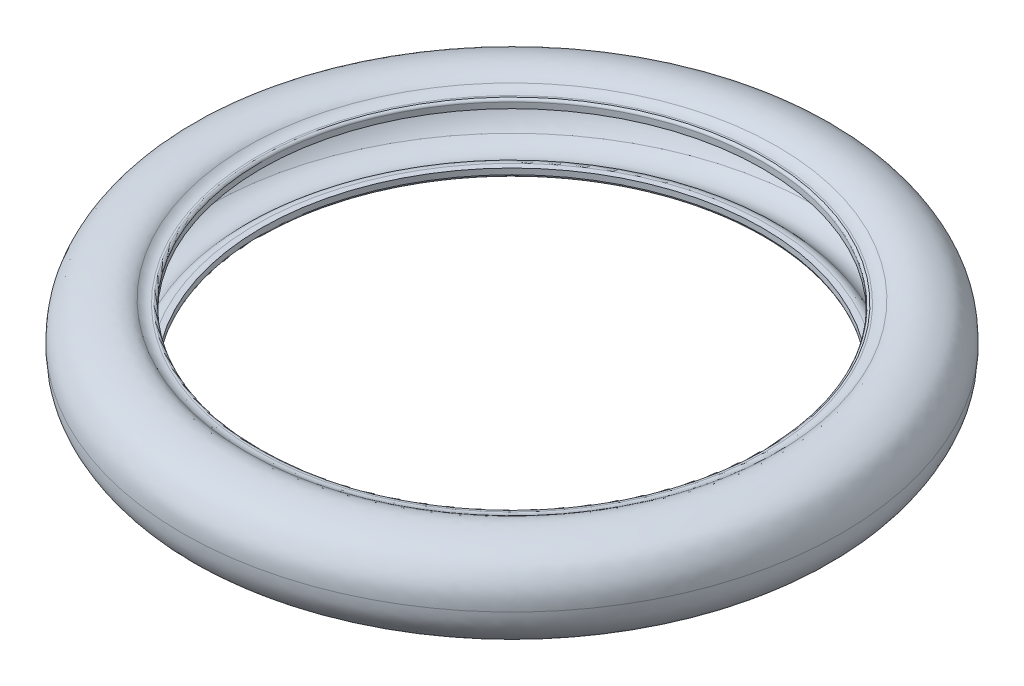
ISO-10303-21;
HEADER;
FILE_DESCRIPTION(('STEP AP214'),'2;1');
FILE_NAME('part.step','',(''),(''),'','','');
FILE_SCHEMA(('AUTOMOTIVE_DESIGN { 1 0 10303 214 1 1 1 1 }'));
ENDSEC;
DATA;
#1=APPLICATION_CONTEXT('core data for automotive mechanical design processes');
#2=APPLICATION_PROTOCOL_DEFINITION('international standard','automotive_design',2000,#1);
#3=PRODUCT_CONTEXT('',#1,'mechanical');
#4=PRODUCT('Part','Part','',(#3));
#5=PRODUCT_RELATED_PRODUCT_CATEGORY('part','',(#4));
#6=PRODUCT_DEFINITION_FORMATION('','',#4);
#7=PRODUCT_DEFINITION_CONTEXT('part definition',#1,'design');
#8=PRODUCT_DEFINITION('design','',#6,#7);
#9=PRODUCT_DEFINITION_SHAPE('','',#8);
#10=(LENGTH_UNIT() NAMED_UNIT(*) SI_UNIT(.MILLI.,.METRE.));
#11=(NAMED_UNIT(*) PLANE_ANGLE_UNIT() SI_UNIT($,.RADIAN.));
#12=(NAMED_UNIT(*) SI_UNIT($,.STERADIAN.) SOLID_ANGLE_UNIT());
#13=UNCERTAINTY_MEASURE_WITH_UNIT(LENGTH_MEASURE(1.E-05),#10,'distance_accuracy_value','');
#14=(GEOMETRIC_REPRESENTATION_CONTEXT(3) GLOBAL_UNCERTAINTY_ASSIGNED_CONTEXT((#13)) GLOBAL_UNIT_ASSIGNED_CONTEXT((#10,
#11,#12)) REPRESENTATION_CONTEXT('',''));
#15=CARTESIAN_POINT('',(0.,0.,0.));
#16=DIRECTION('',(0.,0.,1.));
#17=DIRECTION('',(1.,0.,0.));
#18=AXIS2_PLACEMENT_3D('',#15,#16,#17);
#19=CARTESIAN_POINT('',(142.63119047619,44.0640624999995,0.));
#20=CARTESIAN_POINT('',(142.63119047619,48.4486359022478,0.));
#21=CARTESIAN_POINT('',(142.234474417084,53.4871682416019,0.));
#22=CARTESIAN_POINT('',(139.548984913312,60.6335036895435,0.));
#23=CARTESIAN_POINT('',(137.277996398986,64.4635629481419,0.));
#24=CARTESIAN_POINT('',(131.714043509661,71.8996116292628,0.));
#25=CARTESIAN_POINT('',(124.532463533844,75.146316929885,0.));
#26=CARTESIAN_POINT('',(115.420380537841,77.9769245962998,0.));
#27=CARTESIAN_POINT('',(104.099152613095,79.9741478079657,0.));
#28=CARTESIAN_POINT('',(93.4534855770394,77.2529926246921,0.));
#29=CARTESIAN_POINT('',(90.4251722590828,74.6243240215453,0.));
#30=B_SPLINE_CURVE_WITH_KNOTS('',3,(#19,#20,#21,#22,#23,#24,#25,#26,#27,#28,#29),.UNSPECIFIED.,
.F.,.F.,(4,1,1,1,1,1,1,1,4),(0.,0.140869790199611,0.175397335911017,0.326400110313725,
0.368720757355132,0.556283159283683,0.603112180979877,0.813565674076001,1.),.UNSPECIFIED.);
#31=CARTESIAN_POINT('',(-124.06880952381,89.0640624999997,0.));
#32=DIRECTION('',(0.,1.,0.));
#33=AXIS1_PLACEMENT('',#31,#32);
#34=SURFACE_OF_REVOLUTION('',#30,#33);
#35=CARTESIAN_POINT('',(-124.06880952381,74.6243240215452,0.));
#36=DIRECTION('',(0.,1.,0.));
#37=DIRECTION('',(0.,0.,1.));
#38=AXIS2_PLACEMENT_3D('',#35,#36,#37);
#39=CIRCLE('',#38,214.493981782892);
#40=CARTESIAN_POINT('',(-124.06880952381,74.6243240215452,214.493981782892));
#41=VERTEX_POINT('',#40);
#42=EDGE_CURVE('E10',#41,#41,#39,.T.);
#43=ORIENTED_EDGE('',*,*,#42,.F.);
#44=EDGE_LOOP('',(#43));
#45=FACE_BOUND('',#44,.T.);
#46=CARTESIAN_POINT('',(-124.06880952381,44.0640624999996,0.));
#47=DIRECTION('',(0.,1.,0.));
#48=DIRECTION('',(0.,0.,1.));
#49=AXIS2_PLACEMENT_3D('',#46,#47,#48);
#50=CIRCLE('',#49,266.7);
#51=CARTESIAN_POINT('',(-124.06880952381,44.0640624999996,266.7));
#52=VERTEX_POINT('',#51);
#53=EDGE_CURVE('E93',#52,#52,#50,.T.);
#54=ORIENTED_EDGE('',*,*,#53,.T.);
#55=EDGE_LOOP('',(#54));
#56=FACE_BOUND('',#55,.T.);
#57=ADVANCED_FACE('F28',(#45,#56),#34,.T.);
#58=CARTESIAN_POINT('',(-124.06880952381,84.0640624999998,0.));
#59=DIRECTION('',(0.,1.,0.));
#60=DIRECTION('',(0.,0.,1.));
#61=AXIS2_PLACEMENT_3D('',#58,#59,#60);
#62=TOROIDAL_SURFACE('',#61,206.299999999999,12.5);
#63=CARTESIAN_POINT('',(-124.06880952381,71.5640624999998,0.));
#64=DIRECTION('',(0.,1.,0.));
#65=DIRECTION('',(0.,0.,1.));
#66=AXIS2_PLACEMENT_3D('',#63,#64,#65);
#67=CIRCLE('',#66,206.299999999999);
#68=CARTESIAN_POINT('',(-124.06880952381,71.5640624999998,206.299999999999));
#69=VERTEX_POINT('',#68);
#70=EDGE_CURVE('E35',#69,#69,#67,.T.);
#71=ORIENTED_EDGE('',*,*,#70,.F.);
#72=EDGE_LOOP('',(#71));
#73=FACE_BOUND('',#72,.T.);
#74=ORIENTED_EDGE('',*,*,#42,.T.);
#75=EDGE_LOOP('',(#74));
#76=FACE_BOUND('',#75,.T.);
#77=ADVANCED_FACE('F176',(#73,#76),#62,.F.);
#78=CARTESIAN_POINT('',(82.2311904761896,71.5640624999998,0.));
#79=DIRECTION('',(0.,-1.,0.));
#80=DIRECTION('',(0.,0.,-1.));
#81=AXIS2_PLACEMENT_3D('',#78,#79,#80);
#82=PLANE('',#81);
#83=CARTESIAN_POINT('',(-124.06880952381,71.5640624999998,0.));
#84=DIRECTION('',(0.,1.,0.));
#85=DIRECTION('',(0.,0.,1.));
#86=AXIS2_PLACEMENT_3D('',#83,#84,#85);
#87=CIRCLE('',#86,204.799999999999);
#88=CARTESIAN_POINT('',(-124.06880952381,71.5640624999998,204.799999999999));
#89=VERTEX_POINT('',#88);
#90=EDGE_CURVE('E39',#89,#89,#87,.T.);
#91=ORIENTED_EDGE('',*,*,#90,.F.);
#92=EDGE_LOOP('',(#91));
#93=FACE_BOUND('',#92,.T.);
#94=ORIENTED_EDGE('',*,*,#70,.T.);
#95=EDGE_LOOP('',(#94));
#96=FACE_BOUND('',#95,.T.);
#97=ADVANCED_FACE('F173',(#93,#96),#82,.F.);
#98=CARTESIAN_POINT('',(-124.06880952381,69.5640624999998,0.));
#99=DIRECTION('',(0.,1.,0.));
#100=DIRECTION('',(0.,0.,1.));
#101=AXIS2_PLACEMENT_3D('',#98,#99,#100);
#102=TOROIDAL_SURFACE('',#101,204.799999999999,2.);
#103=CARTESIAN_POINT('',(-124.06880952381,69.5640624999998,0.));
#104=DIRECTION('',(0.,1.,0.));
#105=DIRECTION('',(0.,0.,1.));
#106=AXIS2_PLACEMENT_3D('',#103,#104,#105);
#107=CIRCLE('',#106,202.799999999999);
#108=CARTESIAN_POINT('',(-124.06880952381,69.5640624999998,202.799999999999));
#109=VERTEX_POINT('',#108);
#110=EDGE_CURVE('E43',#109,#109,#107,.T.);
#111=ORIENTED_EDGE('',*,*,#110,.F.);
#112=EDGE_LOOP('',(#111));
#113=FACE_BOUND('',#112,.T.);
#114=ORIENTED_EDGE('',*,*,#90,.T.);
#115=EDGE_LOOP('',(#114));
#116=FACE_BOUND('',#115,.T.);
#117=ADVANCED_FACE('F169',(#113,#116),#102,.T.);
#118=CARTESIAN_POINT('',(-124.06880952381,89.0640624999997,0.));
#119=DIRECTION('',(0.,1.,0.));
#120=DIRECTION('',(0.,0.,1.));
#121=AXIS2_PLACEMENT_3D('',#118,#119,#120);
#122=CYLINDRICAL_SURFACE('',#121,202.799999999999);
#123=CARTESIAN_POINT('',(-124.06880952381,64.8640624999998,0.));
#124=DIRECTION('',(0.,1.,0.));
#125=DIRECTION('',(0.,0.,1.));
#126=AXIS2_PLACEMENT_3D('',#123,#124,#125);
#127=CIRCLE('',#126,202.799999999999);
#128=CARTESIAN_POINT('',(-124.06880952381,64.8640624999998,202.799999999999));
#129=VERTEX_POINT('',#128);
#130=EDGE_CURVE('E48',#129,#129,#127,.T.);
#131=ORIENTED_EDGE('',*,*,#130,.F.);
#132=EDGE_LOOP('',(#131));
#133=FACE_BOUND('',#132,.T.);
#134=ORIENTED_EDGE('',*,*,#110,.T.);
#135=EDGE_LOOP('',(#134));
#136=FACE_BOUND('',#135,.T.);
#137=ADVANCED_FACE('F165',(#133,#136),#122,.F.);
#138=CARTESIAN_POINT('',(83.4049095697965,64.8640624999997,0.));
#139=DIRECTION('',(0.,1.,0.));
#140=DIRECTION('',(0.,0.,1.));
#141=AXIS2_PLACEMENT_3D('',#138,#139,#140);
#142=PLANE('',#141);
#143=CARTESIAN_POINT('',(-124.06880952381,64.8640624999996,0.));
#144=DIRECTION('',(0.,1.,0.));
#145=DIRECTION('',(0.,0.,1.));
#146=AXIS2_PLACEMENT_3D('',#143,#144,#145);
#147=CIRCLE('',#146,207.473719093606);
#148=CARTESIAN_POINT('',(-124.06880952381,64.8640624999996,207.473719093606));
#149=VERTEX_POINT('',#148);
#150=EDGE_CURVE('E51',#149,#149,#147,.T.);
#151=ORIENTED_EDGE('',*,*,#150,.F.);
#152=EDGE_LOOP('',(#151));
#153=FACE_BOUND('',#152,.T.);
#154=ORIENTED_EDGE('',*,*,#130,.T.);
#155=EDGE_LOOP('',(#154));
#156=FACE_BOUND('',#155,.T.);
#157=ADVANCED_FACE('F161',(#153,#156),#142,.F.);
#158=CARTESIAN_POINT('',(-124.06880952381,74.8640624999998,0.));
#159=DIRECTION('',(0.,1.,0.));
#160=DIRECTION('',(0.,0.,1.));
#161=AXIS2_PLACEMENT_3D('',#158,#159,#160);
#162=TOROIDAL_SURFACE('',#161,207.473719093606,10.0000000000002);
#163=CARTESIAN_POINT('',(-124.06880952381,68.4444401825699,0.));
#164=DIRECTION('',(0.,1.,0.));
#165=DIRECTION('',(0.,0.,1.));
#166=AXIS2_PLACEMENT_3D('',#163,#164,#165);
#167=CIRCLE('',#166,215.141081697629);
#168=CARTESIAN_POINT('',(-124.06880952381,68.4444401825699,215.141081697629));
#169=VERTEX_POINT('',#168);
#170=EDGE_CURVE('E54',#169,#169,#167,.T.);
#171=ORIENTED_EDGE('',*,*,#170,.F.);
#172=EDGE_LOOP('',(#171));
#173=FACE_BOUND('',#172,.T.);
#174=ORIENTED_EDGE('',*,*,#150,.T.);
#175=EDGE_LOOP('',(#174));
#176=FACE_BOUND('',#175,.T.);
#177=ADVANCED_FACE('F157',(#173,#176),#162,.T.);
#178=CARTESIAN_POINT('',(-124.06880952381,54.4493282040028,0.));
#179=DIRECTION('',(0.,1.,0.));
#180=DIRECTION('',(0.,0.,1.));
#181=AXIS2_PLACEMENT_3D('',#178,#179,#180);
#182=TOROIDAL_SURFACE('',#181,231.856332676213,21.8005223462577);
#183=CARTESIAN_POINT('',(-124.06880952381,71.0415399142734,0.));
#184=DIRECTION('',(0.,1.,0.));
#185=DIRECTION('',(0.,0.,1.));
#186=AXIS2_PLACEMENT_3D('',#183,#184,#185);
#187=CIRCLE('',#186,245.997099456386);
#188=CARTESIAN_POINT('',(-124.06880952381,71.0415399142734,245.997099456386));
#189=VERTEX_POINT('',#188);
#190=EDGE_CURVE('E57',#189,#189,#187,.T.);
#191=ORIENTED_EDGE('',*,*,#190,.F.);
#192=EDGE_LOOP('',(#191));
#193=FACE_BOUND('',#192,.T.);
#194=ORIENTED_EDGE('',*,*,#170,.T.);
#195=EDGE_LOOP('',(#194));
#196=FACE_BOUND('',#195,.T.);
#197=ADVANCED_FACE('F153',(#193,#196),#182,.F.);
#198=CARTESIAN_POINT('',(-124.06880952381,45.7994527344524,0.));
#199=DIRECTION('',(0.,1.,0.));
#200=DIRECTION('',(0.,0.,1.));
#201=AXIS2_PLACEMENT_3D('',#198,#199,#200);
#202=TOROIDAL_SURFACE('',#201,219.625109618032,36.5054079997458);
#203=CARTESIAN_POINT('',(-124.06880952381,54.5710114053669,0.));
#204=DIRECTION('',(0.,1.,0.));
#205=DIRECTION('',(0.,0.,1.));
#206=AXIS2_PLACEMENT_3D('',#203,#204,#205);
#207=CIRCLE('',#206,255.061031670528);
#208=CARTESIAN_POINT('',(-124.06880952381,54.5710114053669,255.061031670528));
#209=VERTEX_POINT('',#208);
#210=EDGE_CURVE('E60',#209,#209,#207,.T.);
#211=ORIENTED_EDGE('',*,*,#210,.F.);
#212=EDGE_LOOP('',(#211));
#213=FACE_BOUND('',#212,.T.);
#214=ORIENTED_EDGE('',*,*,#190,.T.);
#215=EDGE_LOOP('',(#214));
#216=FACE_BOUND('',#215,.T.);
#217=ADVANCED_FACE('F149',(#213,#216),#202,.F.);
#218=CARTESIAN_POINT('',(-124.06880952381,44.2018461821591,0.));
#219=DIRECTION('',(0.,1.,0.));
#220=DIRECTION('',(0.,0.,1.));
#221=AXIS2_PLACEMENT_3D('',#218,#219,#220);
#222=TOROIDAL_SURFACE('',#221,192.682716566321,63.2342769600945);
#223=CARTESIAN_POINT('',(-124.06880952381,44.0640625000188,0.));
#224=DIRECTION('',(0.,1.,0.));
#225=DIRECTION('',(0.,0.,1.));
#226=AXIS2_PLACEMENT_3D('',#223,#224,#225);
#227=CIRCLE('',#226,255.916843415064);
#228=CARTESIAN_POINT('',(-124.06880952381,44.0640625000188,255.916843415064));
#229=VERTEX_POINT('',#228);
#230=EDGE_CURVE('E63',#229,#229,#227,.T.);
#231=ORIENTED_EDGE('',*,*,#230,.F.);
#232=EDGE_LOOP('',(#231));
#233=FACE_BOUND('',#232,.T.);
#234=ORIENTED_EDGE('',*,*,#210,.T.);
#235=EDGE_LOOP('',(#234));
#236=FACE_BOUND('',#235,.T.);
#237=ADVANCED_FACE('F145',(#233,#236),#222,.F.);
#238=CARTESIAN_POINT('',(-124.06880952381,43.92627881784,0.));
#239=DIRECTION('',(0.,1.,0.));
#240=DIRECTION('',(0.,0.,1.));
#241=AXIS2_PLACEMENT_3D('',#238,#239,#240);
#242=TOROIDAL_SURFACE('',#241,192.682716566321,63.2342769600944);
#243=CARTESIAN_POINT('',(-124.06880952381,33.5571135946301,0.));
#244=DIRECTION('',(0.,1.,0.));
#245=DIRECTION('',(0.,0.,1.));
#246=AXIS2_PLACEMENT_3D('',#243,#244,#245);
#247=CIRCLE('',#246,255.061031670528);
#248=CARTESIAN_POINT('',(-124.06880952381,33.5571135946301,255.061031670528));
#249=VERTEX_POINT('',#248);
#250=EDGE_CURVE('E66',#249,#249,#247,.T.);
#251=ORIENTED_EDGE('',*,*,#250,.F.);
#252=EDGE_LOOP('',(#251));
#253=FACE_BOUND('',#252,.T.);
#254=ORIENTED_EDGE('',*,*,#230,.T.);
#255=EDGE_LOOP('',(#254));
#256=FACE_BOUND('',#255,.T.);
#257=ADVANCED_FACE('F141',(#253,#256),#242,.F.);
#258=CARTESIAN_POINT('',(-124.06880952381,42.3286722655467,0.));
#259=DIRECTION('',(0.,1.,0.));
#260=DIRECTION('',(0.,0.,1.));
#261=AXIS2_PLACEMENT_3D('',#258,#259,#260);
#262=TOROIDAL_SURFACE('',#261,219.625109618032,36.505407999746);
#263=CARTESIAN_POINT('',(-124.06880952381,17.0865850857269,0.));
#264=DIRECTION('',(0.,1.,0.));
#265=DIRECTION('',(0.,0.,1.));
#266=AXIS2_PLACEMENT_3D('',#263,#264,#265);
#267=CIRCLE('',#266,245.997099456387);
#268=CARTESIAN_POINT('',(-124.06880952381,17.0865850857269,245.997099456387));
#269=VERTEX_POINT('',#268);
#270=EDGE_CURVE('E69',#269,#269,#267,.T.);
#271=ORIENTED_EDGE('',*,*,#270,.F.);
#272=EDGE_LOOP('',(#271));
#273=FACE_BOUND('',#272,.T.);
#274=ORIENTED_EDGE('',*,*,#250,.T.);
#275=EDGE_LOOP('',(#274));
#276=FACE_BOUND('',#275,.T.);
#277=ADVANCED_FACE('F137',(#273,#276),#262,.F.);
#278=CARTESIAN_POINT('',(-124.06880952381,33.6787967959963,0.));
#279=DIRECTION('',(0.,1.,0.));
#280=DIRECTION('',(0.,0.,1.));
#281=AXIS2_PLACEMENT_3D('',#278,#279,#280);
#282=TOROIDAL_SURFACE('',#281,231.856332676213,21.8005223462578);
#283=CARTESIAN_POINT('',(-124.06880952381,19.6836848174293,0.));
#284=DIRECTION('',(0.,1.,0.));
#285=DIRECTION('',(0.,0.,1.));
#286=AXIS2_PLACEMENT_3D('',#283,#284,#285);
#287=CIRCLE('',#286,215.141081697629);
#288=CARTESIAN_POINT('',(-124.06880952381,19.6836848174293,215.141081697629));
#289=VERTEX_POINT('',#288);
#290=EDGE_CURVE('E72',#289,#289,#287,.T.);
#291=ORIENTED_EDGE('',*,*,#290,.F.);
#292=EDGE_LOOP('',(#291));
#293=FACE_BOUND('',#292,.T.);
#294=ORIENTED_EDGE('',*,*,#270,.T.);
#295=EDGE_LOOP('',(#294));
#296=FACE_BOUND('',#295,.T.);
#297=ADVANCED_FACE('F133',(#293,#296),#282,.F.);
#298=CARTESIAN_POINT('',(-124.06880952381,13.2640624999994,0.));
#299=DIRECTION('',(0.,1.,0.));
#300=DIRECTION('',(0.,0.,1.));
#301=AXIS2_PLACEMENT_3D('',#298,#299,#300);
#302=TOROIDAL_SURFACE('',#301,207.473719093606,10.0000000000001);
#303=CARTESIAN_POINT('',(-124.06880952381,23.2640624999995,0.));
#304=DIRECTION('',(0.,1.,0.));
#305=DIRECTION('',(0.,0.,1.));
#306=AXIS2_PLACEMENT_3D('',#303,#304,#305);
#307=CIRCLE('',#306,207.473719093606);
#308=CARTESIAN_POINT('',(-124.06880952381,23.2640624999995,207.473719093606));
#309=VERTEX_POINT('',#308);
#310=EDGE_CURVE('E75',#309,#309,#307,.T.);
#311=ORIENTED_EDGE('',*,*,#310,.F.);
#312=EDGE_LOOP('',(#311));
#313=FACE_BOUND('',#312,.T.);
#314=ORIENTED_EDGE('',*,*,#290,.T.);
#315=EDGE_LOOP('',(#314));
#316=FACE_BOUND('',#315,.T.);
#317=ADVANCED_FACE('F129',(#313,#316),#302,.T.);
#318=CARTESIAN_POINT('',(83.4049095697965,23.2640624999995,0.));
#319=DIRECTION('',(0.,-1.,0.));
#320=DIRECTION('',(0.,0.,-1.));
#321=AXIS2_PLACEMENT_3D('',#318,#319,#320);
#322=PLANE('',#321);
#323=CARTESIAN_POINT('',(-124.06880952381,23.2640624999994,0.));
#324=DIRECTION('',(0.,1.,0.));
#325=DIRECTION('',(0.,0.,1.));
#326=AXIS2_PLACEMENT_3D('',#323,#324,#325);
#327=CIRCLE('',#326,202.799999999999);
#328=CARTESIAN_POINT('',(-124.06880952381,23.2640624999994,202.799999999999));
#329=VERTEX_POINT('',#328);
#330=EDGE_CURVE('E78',#329,#329,#327,.T.);
#331=ORIENTED_EDGE('',*,*,#330,.F.);
#332=EDGE_LOOP('',(#331));
#333=FACE_BOUND('',#332,.T.);
#334=ORIENTED_EDGE('',*,*,#310,.T.);
#335=EDGE_LOOP('',(#334));
#336=FACE_BOUND('',#335,.T.);
#337=ADVANCED_FACE('F125',(#333,#336),#322,.F.);
#338=CARTESIAN_POINT('',(-124.06880952381,89.0640624999997,0.));
#339=DIRECTION('',(0.,1.,0.));
#340=DIRECTION('',(0.,0.,1.));
#341=AXIS2_PLACEMENT_3D('',#338,#339,#340);
#342=CYLINDRICAL_SURFACE('',#341,202.799999999999);
#343=CARTESIAN_POINT('',(-124.06880952381,18.5640624999994,0.));
#344=DIRECTION('',(0.,1.,0.));
#345=DIRECTION('',(0.,0.,1.));
#346=AXIS2_PLACEMENT_3D('',#343,#344,#345);
#347=CIRCLE('',#346,202.799999999999);
#348=CARTESIAN_POINT('',(-124.06880952381,18.5640624999994,202.799999999999));
#349=VERTEX_POINT('',#348);
#350=EDGE_CURVE('E81',#349,#349,#347,.T.);
#351=ORIENTED_EDGE('',*,*,#350,.F.);
#352=EDGE_LOOP('',(#351));
#353=FACE_BOUND('',#352,.T.);
#354=ORIENTED_EDGE('',*,*,#330,.T.);
#355=EDGE_LOOP('',(#354));
#356=FACE_BOUND('',#355,.T.);
#357=ADVANCED_FACE('F121',(#353,#356),#342,.F.);
#358=CARTESIAN_POINT('',(-124.06880952381,18.5640624999994,0.));
#359=DIRECTION('',(0.,1.,0.));
#360=DIRECTION('',(0.,0.,1.));
#361=AXIS2_PLACEMENT_3D('',#358,#359,#360);
#362=TOROIDAL_SURFACE('',#361,204.799999999999,2.);
#363=CARTESIAN_POINT('',(-124.06880952381,16.5640624999994,0.));
#364=DIRECTION('',(0.,1.,0.));
#365=DIRECTION('',(0.,0.,1.));
#366=AXIS2_PLACEMENT_3D('',#363,#364,#365);
#367=CIRCLE('',#366,204.799999999999);
#368=CARTESIAN_POINT('',(-124.06880952381,16.5640624999994,204.799999999999));
#369=VERTEX_POINT('',#368);
#370=EDGE_CURVE('E84',#369,#369,#367,.T.);
#371=ORIENTED_EDGE('',*,*,#370,.F.);
#372=EDGE_LOOP('',(#371));
#373=FACE_BOUND('',#372,.T.);
#374=ORIENTED_EDGE('',*,*,#350,.T.);
#375=EDGE_LOOP('',(#374));
#376=FACE_BOUND('',#375,.T.);
#377=ADVANCED_FACE('F117',(#373,#376),#362,.T.);
#378=CARTESIAN_POINT('',(82.2311904761896,16.5640624999994,0.));
#379=DIRECTION('',(0.,1.,0.));
#380=DIRECTION('',(0.,0.,1.));
#381=AXIS2_PLACEMENT_3D('',#378,#379,#380);
#382=PLANE('',#381);
#383=CARTESIAN_POINT('',(-124.06880952381,16.5640624999994,0.));
#384=DIRECTION('',(0.,1.,0.));
#385=DIRECTION('',(0.,0.,1.));
#386=AXIS2_PLACEMENT_3D('',#383,#384,#385);
#387=CIRCLE('',#386,206.299999999999);
#388=CARTESIAN_POINT('',(-124.06880952381,16.5640624999994,206.299999999999));
#389=VERTEX_POINT('',#388);
#390=EDGE_CURVE('E87',#389,#389,#387,.T.);
#391=ORIENTED_EDGE('',*,*,#390,.F.);
#392=EDGE_LOOP('',(#391));
#393=FACE_BOUND('',#392,.T.);
#394=ORIENTED_EDGE('',*,*,#370,.T.);
#395=EDGE_LOOP('',(#394));
#396=FACE_BOUND('',#395,.T.);
#397=ADVANCED_FACE('F113',(#393,#396),#382,.F.);
#398=CARTESIAN_POINT('',(-124.06880952381,4.06406249999924,0.));
#399=DIRECTION('',(0.,1.,0.));
#400=DIRECTION('',(0.,0.,1.));
#401=AXIS2_PLACEMENT_3D('',#398,#399,#400);
#402=TOROIDAL_SURFACE('',#401,206.299999999999,12.5000000000001);
#403=CARTESIAN_POINT('',(-124.06880952381,13.503800978454,0.));
#404=DIRECTION('',(0.,1.,0.));
#405=DIRECTION('',(0.,0.,1.));
#406=AXIS2_PLACEMENT_3D('',#403,#404,#405);
#407=CIRCLE('',#406,214.493981782892);
#408=CARTESIAN_POINT('',(-124.06880952381,13.503800978454,214.493981782892));
#409=VERTEX_POINT('',#408);
#410=EDGE_CURVE('E90',#409,#409,#407,.T.);
#411=ORIENTED_EDGE('',*,*,#410,.F.);
#412=EDGE_LOOP('',(#411));
#413=FACE_BOUND('',#412,.T.);
#414=ORIENTED_EDGE('',*,*,#390,.T.);
#415=EDGE_LOOP('',(#414));
#416=FACE_BOUND('',#415,.T.);
#417=ADVANCED_FACE('F109',(#413,#416),#402,.F.);
#418=CARTESIAN_POINT('',(90.4251722590828,13.5038009784538,0.));
#419=CARTESIAN_POINT('',(93.4534855770394,10.8751323753071,0.));
#420=CARTESIAN_POINT('',(104.099152613095,8.15397719203348,0.));
#421=CARTESIAN_POINT('',(115.420380537841,10.1512004036993,0.));
#422=CARTESIAN_POINT('',(124.532463533844,12.9818080701141,0.));
#423=CARTESIAN_POINT('',(131.714043509661,16.2285133707364,0.));
#424=CARTESIAN_POINT('',(137.277996398986,23.6645620518573,0.));
#425=CARTESIAN_POINT('',(139.548984913312,27.4946213104557,0.));
#426=CARTESIAN_POINT('',(142.234474417084,34.6409567583973,0.));
#427=CARTESIAN_POINT('',(142.63119047619,39.6794890977514,0.));
#428=CARTESIAN_POINT('',(142.63119047619,44.0640624999996,0.));
#429=B_SPLINE_CURVE_WITH_KNOTS('',3,(#418,#419,#420,#421,#422,#423,#424,#425,#426,#427,#428),
.UNSPECIFIED.,.F.,.F.,(4,1,1,1,1,1,1,1,4),(0.,0.186434325923999,0.396887819020123,
0.443716840716317,0.631279242644868,0.673599889686275,0.824602664088983,0.859130209800389,1.),.UNSPECIFIED.);
#430=CARTESIAN_POINT('',(-124.06880952381,89.0640624999997,0.));
#431=DIRECTION('',(0.,1.,0.));
#432=AXIS1_PLACEMENT('',#430,#431);
#433=SURFACE_OF_REVOLUTION('',#429,#432);
#434=ORIENTED_EDGE('',*,*,#53,.F.);
#435=EDGE_LOOP('',(#434));
#436=FACE_BOUND('',#435,.T.);
#437=ORIENTED_EDGE('',*,*,#410,.T.);
#438=EDGE_LOOP('',(#437));
#439=FACE_BOUND('',#438,.T.);
#440=ADVANCED_FACE('F106',(#436,#439),#433,.T.);
#441=CLOSED_SHELL('',(#57,#77,#97,#117,#137,#157,#177,#197,#217,#237,#257,#277,#297,#317,#337,
#357,#377,#397,#417,#440));
#442=MANIFOLD_SOLID_BREP('B2',#441);
#443=ADVANCED_BREP_SHAPE_REPRESENTATION('',(#18,#442),#14);
#444=SHAPE_DEFINITION_REPRESENTATION(#9,#443);
ENDSEC;
END-ISO-10303-21;
